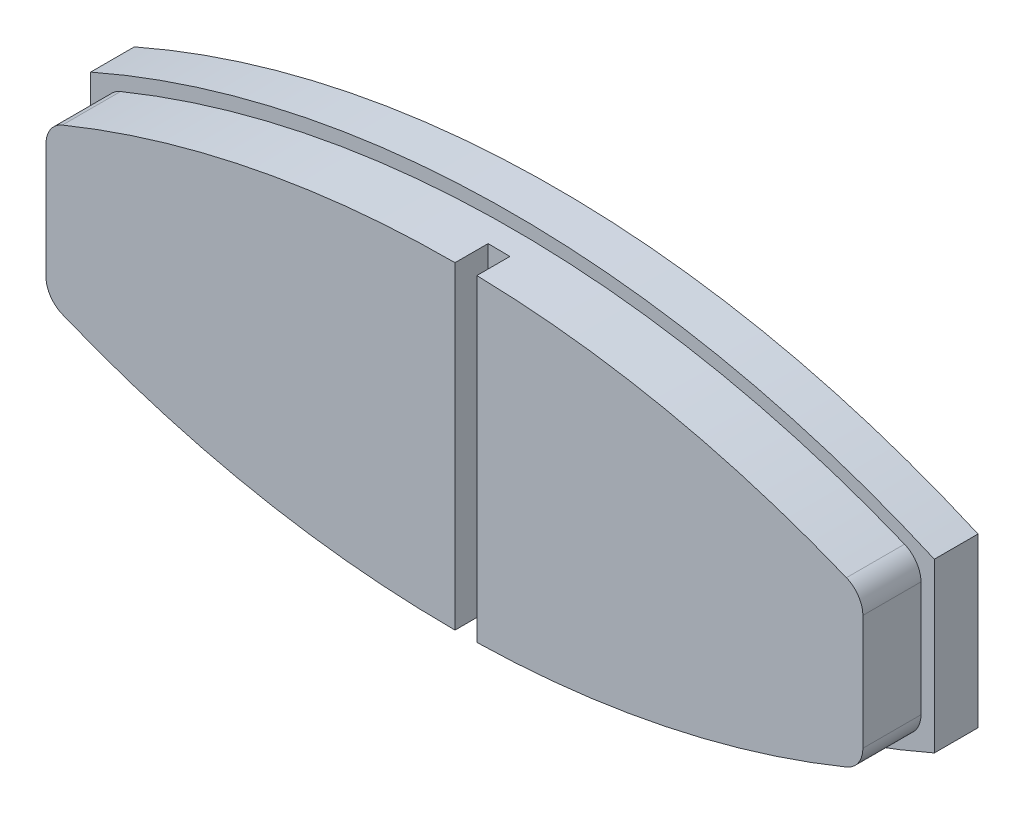
ISO-10303-21;
HEADER;
FILE_DESCRIPTION(('STEP AP214'),'2;1');
FILE_NAME('part.step','',(''),(''),'','','');
FILE_SCHEMA(('AUTOMOTIVE_DESIGN { 1 0 10303 214 1 1 1 1 }'));
ENDSEC;
DATA;
#1=APPLICATION_CONTEXT('core data for automotive mechanical design processes');
#2=APPLICATION_PROTOCOL_DEFINITION('international standard','automotive_design',2000,#1);
#3=PRODUCT_CONTEXT('',#1,'mechanical');
#4=PRODUCT('Part','Part','',(#3));
#5=PRODUCT_RELATED_PRODUCT_CATEGORY('part','',(#4));
#6=PRODUCT_DEFINITION_FORMATION('','',#4);
#7=PRODUCT_DEFINITION_CONTEXT('part definition',#1,'design');
#8=PRODUCT_DEFINITION('design','',#6,#7);
#9=PRODUCT_DEFINITION_SHAPE('','',#8);
#10=(LENGTH_UNIT() NAMED_UNIT(*) SI_UNIT(.MILLI.,.METRE.));
#11=(NAMED_UNIT(*) PLANE_ANGLE_UNIT() SI_UNIT($,.RADIAN.));
#12=(NAMED_UNIT(*) SI_UNIT($,.STERADIAN.) SOLID_ANGLE_UNIT());
#13=UNCERTAINTY_MEASURE_WITH_UNIT(LENGTH_MEASURE(1.E-05),#10,'distance_accuracy_value','');
#14=(GEOMETRIC_REPRESENTATION_CONTEXT(3) GLOBAL_UNCERTAINTY_ASSIGNED_CONTEXT((#13)) GLOBAL_UNIT_ASSIGNED_CONTEXT((#10,
#11,#12)) REPRESENTATION_CONTEXT('',''));
#15=CARTESIAN_POINT('',(0.,0.,0.));
#16=DIRECTION('',(0.,0.,1.));
#17=DIRECTION('',(1.,0.,0.));
#18=AXIS2_PLACEMENT_3D('',#15,#16,#17);
#19=CARTESIAN_POINT('',(0.,-66.2769013020833,7.6962));
#20=DIRECTION('',(0.,0.,1.));
#21=DIRECTION('',(1.,0.,0.));
#22=AXIS2_PLACEMENT_3D('',#19,#20,#21);
#23=PLANE('',#22);
#24=DIRECTION('',(0.,-1.,0.));
#25=VECTOR('',#24,1.);
#26=CARTESIAN_POINT('',(-30.90545,5.68369580839595,7.6962));
#27=LINE('',#26,#25);
#28=CARTESIAN_POINT('',(-30.90545,4.3537105548756,7.6962));
#29=VERTEX_POINT('',#28);
#30=CARTESIAN_POINT('',(-30.90545,-4.35371055487559,7.6962));
#31=VERTEX_POINT('',#30);
#32=EDGE_CURVE('E150',#29,#31,#27,.T.);
#33=ORIENTED_EDGE('',*,*,#32,.T.);
#34=CARTESIAN_POINT('',(-28.90545,-4.35371055487559,7.6962));
#35=DIRECTION('',(0.,0.,1.));
#36=DIRECTION('',(1.,0.,0.));
#37=AXIS2_PLACEMENT_3D('',#34,#35,#36);
#38=CIRCLE('',#37,2.);
#39=CARTESIAN_POINT('',(-29.66296507228,-6.20470242824206,7.6962));
#40=VERTEX_POINT('',#39);
#41=EDGE_CURVE('E219',#31,#40,#38,.T.);
#42=ORIENTED_EDGE('',*,*,#41,.T.);
#43=CARTESIAN_POINT('',(0.,66.2769013020833,7.6962));
#44=DIRECTION('',(0.,0.,1.));
#45=DIRECTION('',(1.,0.,0.));
#46=AXIS2_PLACEMENT_3D('',#43,#44,#45);
#47=CIRCLE('',#46,78.3165013020833);
#48=CARTESIAN_POINT('',(0.044450000000005,-12.0395873857832,7.6962));
#49=VERTEX_POINT('',#48);
#50=EDGE_CURVE('E183',#40,#49,#47,.T.);
#51=ORIENTED_EDGE('',*,*,#50,.T.);
#52=DIRECTION('',(0.,-1.,0.));
#53=VECTOR('',#52,1.);
#54=CARTESIAN_POINT('',(0.0444500000000116,-66.2769013020833,7.6962));
#55=LINE('',#54,#53);
#56=CARTESIAN_POINT('',(0.044450000000002,12.0395873857832,7.6962));
#57=VERTEX_POINT('',#56);
#58=EDGE_CURVE('E160',#57,#49,#55,.T.);
#59=ORIENTED_EDGE('',*,*,#58,.F.);
#60=CARTESIAN_POINT('',(0.,-66.2769013020833,7.6962));
#61=DIRECTION('',(0.,0.,1.));
#62=DIRECTION('',(1.,0.,0.));
#63=AXIS2_PLACEMENT_3D('',#60,#61,#62);
#64=CIRCLE('',#63,78.3165013020833);
#65=CARTESIAN_POINT('',(-29.6629650722799,6.20470242824206,7.6962));
#66=VERTEX_POINT('',#65);
#67=EDGE_CURVE('E151',#57,#66,#64,.T.);
#68=ORIENTED_EDGE('',*,*,#67,.T.);
#69=CARTESIAN_POINT('',(-28.90545,4.3537105548756,7.6962));
#70=DIRECTION('',(0.,0.,1.));
#71=DIRECTION('',(1.,0.,0.));
#72=AXIS2_PLACEMENT_3D('',#69,#70,#71);
#73=CIRCLE('',#72,2.);
#74=EDGE_CURVE('E217',#66,#29,#73,.T.);
#75=ORIENTED_EDGE('',*,*,#74,.T.);
#76=EDGE_LOOP('',(#33,#42,#51,#59,#68,#75));
#77=FACE_BOUND('',#76,.T.);
#78=ADVANCED_FACE('F52',(#77),#23,.T.);
#79=CARTESIAN_POINT('',(0.,-66.2769013020833,7.6962));
#80=DIRECTION('',(0.,0.,-1.));
#81=DIRECTION('',(-1.,0.,0.));
#82=AXIS2_PLACEMENT_3D('',#79,#80,#81);
#83=CYLINDRICAL_SURFACE('',#82,78.3165013020833);
#84=CARTESIAN_POINT('',(0.,-66.2769013020833,3.302));
#85=DIRECTION('',(0.,0.,1.));
#86=DIRECTION('',(1.,0.,0.));
#87=AXIS2_PLACEMENT_3D('',#84,#85,#86);
#88=CIRCLE('',#87,78.3165013020833);
#89=CARTESIAN_POINT('',(29.6629650722799,6.20470242824206,3.302));
#90=VERTEX_POINT('',#89);
#91=CARTESIAN_POINT('',(-29.6629650722799,6.20470242824206,3.302));
#92=VERTEX_POINT('',#91);
#93=EDGE_CURVE('E178',#90,#92,#88,.T.);
#94=ORIENTED_EDGE('',*,*,#93,.T.);
#95=DIRECTION('',(0.,0.,-1.));
#96=VECTOR('',#95,1.);
#97=CARTESIAN_POINT('',(-29.6629650722799,6.20470242824206,7.6962));
#98=LINE('',#97,#96);
#99=EDGE_CURVE('E223',#92,#66,#98,.F.);
#100=ORIENTED_EDGE('',*,*,#99,.T.);
#101=ORIENTED_EDGE('',*,*,#67,.F.);
#102=DIRECTION('',(0.,0.,-1.));
#103=VECTOR('',#102,1.);
#104=CARTESIAN_POINT('',(0.044450000000002,12.0395873857832,7.6962));
#105=LINE('',#104,#103);
#106=CARTESIAN_POINT('',(0.044450000000002,12.0395873857832,5.1962));
#107=VERTEX_POINT('',#106);
#108=EDGE_CURVE('E171',#57,#107,#105,.T.);
#109=ORIENTED_EDGE('',*,*,#108,.T.);
#110=CARTESIAN_POINT('',(0.,-66.2769013020833,5.1962));
#111=DIRECTION('',(0.,0.,1.));
#112=DIRECTION('',(1.,0.,0.));
#113=AXIS2_PLACEMENT_3D('',#110,#111,#112);
#114=CIRCLE('',#113,78.3165013020833);
#115=CARTESIAN_POINT('',(1.69545,12.0212457098142,5.1962));
#116=VERTEX_POINT('',#115);
#117=EDGE_CURVE('E167',#116,#107,#114,.T.);
#118=ORIENTED_EDGE('',*,*,#117,.F.);
#119=DIRECTION('',(0.,0.,-1.));
#120=VECTOR('',#119,1.);
#121=CARTESIAN_POINT('',(1.69545,12.0212457098142,7.6962));
#122=LINE('',#121,#120);
#123=CARTESIAN_POINT('',(1.69545,12.0212457098142,7.6962));
#124=VERTEX_POINT('',#123);
#125=EDGE_CURVE('E156',#116,#124,#122,.F.);
#126=ORIENTED_EDGE('',*,*,#125,.T.);
#127=CARTESIAN_POINT('',(29.6629650722799,6.20470242824206,7.6962));
#128=VERTEX_POINT('',#127);
#129=EDGE_CURVE('E140',#128,#124,#64,.T.);
#130=ORIENTED_EDGE('',*,*,#129,.F.);
#131=DIRECTION('',(0.,0.,-1.));
#132=VECTOR('',#131,1.);
#133=CARTESIAN_POINT('',(29.6629650722799,6.20470242824206,7.6962));
#134=LINE('',#133,#132);
#135=EDGE_CURVE('E221',#128,#90,#134,.T.);
#136=ORIENTED_EDGE('',*,*,#135,.T.);
#137=EDGE_LOOP('',(#94,#100,#101,#109,#118,#126,#130,#136));
#138=FACE_BOUND('',#137,.T.);
#139=ADVANCED_FACE('F165',(#138),#83,.T.);
#140=CARTESIAN_POINT('',(-30.90545,5.68369580839595,7.6962));
#141=DIRECTION('',(1.,0.,0.));
#142=DIRECTION('',(0.,1.,0.));
#143=AXIS2_PLACEMENT_3D('',#140,#141,#142);
#144=PLANE('',#143);
#145=DIRECTION('',(0.,-1.,0.));
#146=VECTOR('',#145,1.);
#147=CARTESIAN_POINT('',(-30.90545,5.68369580839595,3.302));
#148=LINE('',#147,#146);
#149=CARTESIAN_POINT('',(-30.90545,4.3537105548756,3.302));
#150=VERTEX_POINT('',#149);
#151=CARTESIAN_POINT('',(-30.90545,-4.35371055487559,3.302));
#152=VERTEX_POINT('',#151);
#153=EDGE_CURVE('E187',#150,#152,#148,.T.);
#154=ORIENTED_EDGE('',*,*,#153,.T.);
#155=DIRECTION('',(0.,0.,-1.));
#156=VECTOR('',#155,1.);
#157=CARTESIAN_POINT('',(-30.90545,-4.35371055487559,7.6962));
#158=LINE('',#157,#156);
#159=EDGE_CURVE('E215',#152,#31,#158,.F.);
#160=ORIENTED_EDGE('',*,*,#159,.T.);
#161=ORIENTED_EDGE('',*,*,#32,.F.);
#162=DIRECTION('',(0.,0.,-1.));
#163=VECTOR('',#162,1.);
#164=CARTESIAN_POINT('',(-30.90545,4.3537105548756,7.6962));
#165=LINE('',#164,#163);
#166=EDGE_CURVE('E212',#29,#150,#165,.T.);
#167=ORIENTED_EDGE('',*,*,#166,.T.);
#168=EDGE_LOOP('',(#154,#160,#161,#167));
#169=FACE_BOUND('',#168,.T.);
#170=ADVANCED_FACE('F250',(#169),#144,.F.);
#171=CARTESIAN_POINT('',(0.,66.2769013020833,7.6962));
#172=DIRECTION('',(0.,0.,-1.));
#173=DIRECTION('',(-1.,0.,0.));
#174=AXIS2_PLACEMENT_3D('',#171,#172,#173);
#175=CYLINDRICAL_SURFACE('',#174,78.3165013020833);
#176=ORIENTED_EDGE('',*,*,#50,.F.);
#177=DIRECTION('',(0.,0.,-1.));
#178=VECTOR('',#177,1.);
#179=CARTESIAN_POINT('',(-29.66296507228,-6.20470242824206,7.6962));
#180=LINE('',#179,#178);
#181=CARTESIAN_POINT('',(-29.66296507228,-6.20470242824206,3.302));
#182=VERTEX_POINT('',#181);
#183=EDGE_CURVE('E201',#40,#182,#180,.T.);
#184=ORIENTED_EDGE('',*,*,#183,.T.);
#185=CARTESIAN_POINT('',(0.,66.2769013020833,3.302));
#186=DIRECTION('',(0.,0.,1.));
#187=DIRECTION('',(1.,0.,0.));
#188=AXIS2_PLACEMENT_3D('',#185,#186,#187);
#189=CIRCLE('',#188,78.3165013020833);
#190=CARTESIAN_POINT('',(29.6629650722799,-6.20470242824206,3.302));
#191=VERTEX_POINT('',#190);
#192=EDGE_CURVE('E190',#182,#191,#189,.T.);
#193=ORIENTED_EDGE('',*,*,#192,.T.);
#194=DIRECTION('',(0.,0.,-1.));
#195=VECTOR('',#194,1.);
#196=CARTESIAN_POINT('',(29.6629650722799,-6.20470242824206,7.6962));
#197=LINE('',#196,#195);
#198=CARTESIAN_POINT('',(29.6629650722799,-6.20470242824206,7.6962));
#199=VERTEX_POINT('',#198);
#200=EDGE_CURVE('E199',#191,#199,#197,.F.);
#201=ORIENTED_EDGE('',*,*,#200,.T.);
#202=CARTESIAN_POINT('',(1.69545,-12.0212457098142,7.6962));
#203=VERTEX_POINT('',#202);
#204=EDGE_CURVE('E182',#203,#199,#47,.T.);
#205=ORIENTED_EDGE('',*,*,#204,.F.);
#206=DIRECTION('',(0.,0.,-1.));
#207=VECTOR('',#206,1.);
#208=CARTESIAN_POINT('',(1.69545,-12.0212457098142,7.6962));
#209=LINE('',#208,#207);
#210=CARTESIAN_POINT('',(1.69545,-12.0212457098142,5.1962));
#211=VERTEX_POINT('',#210);
#212=EDGE_CURVE('E159',#203,#211,#209,.T.);
#213=ORIENTED_EDGE('',*,*,#212,.T.);
#214=CARTESIAN_POINT('',(0.,66.2769013020833,5.1962));
#215=DIRECTION('',(0.,0.,1.));
#216=DIRECTION('',(1.,0.,0.));
#217=AXIS2_PLACEMENT_3D('',#214,#215,#216);
#218=CIRCLE('',#217,78.3165013020833);
#219=CARTESIAN_POINT('',(0.044450000000005,-12.0395873857832,5.1962));
#220=VERTEX_POINT('',#219);
#221=EDGE_CURVE('E197',#220,#211,#218,.T.);
#222=ORIENTED_EDGE('',*,*,#221,.F.);
#223=DIRECTION('',(0.,0.,-1.));
#224=VECTOR('',#223,1.);
#225=CARTESIAN_POINT('',(0.044450000000005,-12.0395873857832,7.6962));
#226=LINE('',#225,#224);
#227=EDGE_CURVE('E168',#220,#49,#226,.F.);
#228=ORIENTED_EDGE('',*,*,#227,.T.);
#229=EDGE_LOOP('',(#176,#184,#193,#201,#205,#213,#222,#228));
#230=FACE_BOUND('',#229,.T.);
#231=ADVANCED_FACE('F258',(#230),#175,.T.);
#232=CARTESIAN_POINT('',(30.90545,-5.68369580839595,7.6962));
#233=DIRECTION('',(-1.,0.,0.));
#234=DIRECTION('',(0.,0.,1.));
#235=AXIS2_PLACEMENT_3D('',#232,#233,#234);
#236=PLANE('',#235);
#237=DIRECTION('',(0.,1.,0.));
#238=VECTOR('',#237,1.);
#239=CARTESIAN_POINT('',(30.90545,-5.68369580839595,3.302));
#240=LINE('',#239,#238);
#241=CARTESIAN_POINT('',(30.90545,-4.35371055487559,3.302));
#242=VERTEX_POINT('',#241);
#243=CARTESIAN_POINT('',(30.90545,4.35371055487559,3.302));
#244=VERTEX_POINT('',#243);
#245=EDGE_CURVE('E193',#242,#244,#240,.T.);
#246=ORIENTED_EDGE('',*,*,#245,.T.);
#247=DIRECTION('',(0.,0.,-1.));
#248=VECTOR('',#247,1.);
#249=CARTESIAN_POINT('',(30.90545,4.35371055487559,7.6962));
#250=LINE('',#249,#248);
#251=CARTESIAN_POINT('',(30.90545,4.35371055487559,7.6962));
#252=VERTEX_POINT('',#251);
#253=EDGE_CURVE('E67',#244,#252,#250,.F.);
#254=ORIENTED_EDGE('',*,*,#253,.T.);
#255=DIRECTION('',(0.,1.,0.));
#256=VECTOR('',#255,1.);
#257=CARTESIAN_POINT('',(30.90545,-5.68369580839595,7.6962));
#258=LINE('',#257,#256);
#259=CARTESIAN_POINT('',(30.90545,-4.35371055487559,7.6962));
#260=VERTEX_POINT('',#259);
#261=EDGE_CURVE('E161',#260,#252,#258,.T.);
#262=ORIENTED_EDGE('',*,*,#261,.F.);
#263=DIRECTION('',(0.,0.,-1.));
#264=VECTOR('',#263,1.);
#265=CARTESIAN_POINT('',(30.90545,-4.35371055487559,7.6962));
#266=LINE('',#265,#264);
#267=EDGE_CURVE('E225',#260,#242,#266,.T.);
#268=ORIENTED_EDGE('',*,*,#267,.T.);
#269=EDGE_LOOP('',(#246,#254,#262,#268));
#270=FACE_BOUND('',#269,.T.);
#271=ADVANCED_FACE('F230',(#270),#236,.F.);
#272=ORIENTED_EDGE('',*,*,#261,.T.);
#273=CARTESIAN_POINT('',(28.90545,4.35371055487559,7.6962));
#274=DIRECTION('',(0.,0.,1.));
#275=DIRECTION('',(1.,0.,0.));
#276=AXIS2_PLACEMENT_3D('',#273,#274,#275);
#277=CIRCLE('',#276,2.);
#278=EDGE_CURVE('E12',#252,#128,#277,.T.);
#279=ORIENTED_EDGE('',*,*,#278,.T.);
#280=ORIENTED_EDGE('',*,*,#129,.T.);
#281=DIRECTION('',(0.,1.,0.));
#282=VECTOR('',#281,1.);
#283=CARTESIAN_POINT('',(1.69545000000001,-66.2769013020833,7.6962));
#284=LINE('',#283,#282);
#285=EDGE_CURVE('E143',#203,#124,#284,.T.);
#286=ORIENTED_EDGE('',*,*,#285,.F.);
#287=ORIENTED_EDGE('',*,*,#204,.T.);
#288=CARTESIAN_POINT('',(28.90545,-4.35371055487559,7.6962));
#289=DIRECTION('',(0.,0.,1.));
#290=DIRECTION('',(1.,0.,0.));
#291=AXIS2_PLACEMENT_3D('',#288,#289,#290);
#292=CIRCLE('',#291,2.);
#293=EDGE_CURVE('E60',#199,#260,#292,.T.);
#294=ORIENTED_EDGE('',*,*,#293,.T.);
#295=EDGE_LOOP('',(#272,#279,#280,#286,#287,#294));
#296=FACE_BOUND('',#295,.T.);
#297=ADVANCED_FACE('F142',(#296),#23,.T.);
#298=CARTESIAN_POINT('',(0.,-66.2769013020833,3.302));
#299=DIRECTION('',(0.,0.,1.));
#300=DIRECTION('',(1.,0.,0.));
#301=AXIS2_PLACEMENT_3D('',#298,#299,#300);
#302=PLANE('',#301);
#303=ORIENTED_EDGE('',*,*,#192,.F.);
#304=CARTESIAN_POINT('',(-28.90545,-4.35371055487559,3.302));
#305=DIRECTION('',(0.,0.,1.));
#306=DIRECTION('',(1.,0.,0.));
#307=AXIS2_PLACEMENT_3D('',#304,#305,#306);
#308=CIRCLE('',#307,2.);
#309=EDGE_CURVE('E210',#182,#152,#308,.F.);
#310=ORIENTED_EDGE('',*,*,#309,.T.);
#311=ORIENTED_EDGE('',*,*,#153,.F.);
#312=CARTESIAN_POINT('',(-28.90545,4.3537105548756,3.302));
#313=DIRECTION('',(0.,0.,1.));
#314=DIRECTION('',(1.,0.,0.));
#315=AXIS2_PLACEMENT_3D('',#312,#313,#314);
#316=CIRCLE('',#315,2.);
#317=EDGE_CURVE('E208',#150,#92,#316,.F.);
#318=ORIENTED_EDGE('',*,*,#317,.T.);
#319=ORIENTED_EDGE('',*,*,#93,.F.);
#320=CARTESIAN_POINT('',(28.90545,4.35371055487559,3.302));
#321=DIRECTION('',(0.,0.,1.));
#322=DIRECTION('',(1.,0.,0.));
#323=AXIS2_PLACEMENT_3D('',#320,#321,#322);
#324=CIRCLE('',#323,2.);
#325=EDGE_CURVE('E206',#90,#244,#324,.F.);
#326=ORIENTED_EDGE('',*,*,#325,.T.);
#327=ORIENTED_EDGE('',*,*,#245,.F.);
#328=CARTESIAN_POINT('',(28.90545,-4.35371055487559,3.302));
#329=DIRECTION('',(0.,0.,1.));
#330=DIRECTION('',(1.,0.,0.));
#331=AXIS2_PLACEMENT_3D('',#328,#329,#330);
#332=CIRCLE('',#331,2.);
#333=EDGE_CURVE('E204',#242,#191,#332,.F.);
#334=ORIENTED_EDGE('',*,*,#333,.T.);
#335=EDGE_LOOP('',(#303,#310,#311,#318,#319,#326,#327,#334));
#336=FACE_BOUND('',#335,.T.);
#337=ADVANCED_FACE('F234',(#336),#302,.F.);
#338=CARTESIAN_POINT('',(0.,0.,5.1962));
#339=DIRECTION('',(0.,0.,1.));
#340=DIRECTION('',(1.,0.,0.));
#341=AXIS2_PLACEMENT_3D('',#338,#339,#340);
#342=PLANE('',#341);
#343=ORIENTED_EDGE('',*,*,#117,.T.);
#344=DIRECTION('',(0.,-1.,0.));
#345=VECTOR('',#344,1.);
#346=CARTESIAN_POINT('',(0.0444500000000012,18.5167794108381,5.1962));
#347=LINE('',#346,#345);
#348=EDGE_CURVE('E264',#107,#220,#347,.T.);
#349=ORIENTED_EDGE('',*,*,#348,.T.);
#350=ORIENTED_EDGE('',*,*,#221,.T.);
#351=DIRECTION('',(0.,1.,0.));
#352=VECTOR('',#351,1.);
#353=CARTESIAN_POINT('',(1.69545,18.5167794108381,5.1962));
#354=LINE('',#353,#352);
#355=EDGE_CURVE('E173',#211,#116,#354,.T.);
#356=ORIENTED_EDGE('',*,*,#355,.T.);
#357=EDGE_LOOP('',(#343,#349,#350,#356));
#358=FACE_BOUND('',#357,.T.);
#359=ADVANCED_FACE('F266',(#358),#342,.T.);
#360=CARTESIAN_POINT('',(0.0444500000000012,18.5167794108381,5.1962));
#361=DIRECTION('',(-1.,0.,0.));
#362=DIRECTION('',(0.,-1.,0.));
#363=AXIS2_PLACEMENT_3D('',#360,#361,#362);
#364=PLANE('',#363);
#365=ORIENTED_EDGE('',*,*,#58,.T.);
#366=ORIENTED_EDGE('',*,*,#227,.F.);
#367=ORIENTED_EDGE('',*,*,#348,.F.);
#368=ORIENTED_EDGE('',*,*,#108,.F.);
#369=EDGE_LOOP('',(#365,#366,#367,#368));
#370=FACE_BOUND('',#369,.T.);
#371=ADVANCED_FACE('F263',(#370),#364,.F.);
#372=CARTESIAN_POINT('',(1.69545,18.5167794108381,5.1962));
#373=DIRECTION('',(1.,0.,0.));
#374=DIRECTION('',(0.,1.,0.));
#375=AXIS2_PLACEMENT_3D('',#372,#373,#374);
#376=PLANE('',#375);
#377=ORIENTED_EDGE('',*,*,#355,.F.);
#378=ORIENTED_EDGE('',*,*,#212,.F.);
#379=ORIENTED_EDGE('',*,*,#285,.T.);
#380=ORIENTED_EDGE('',*,*,#125,.F.);
#381=EDGE_LOOP('',(#377,#378,#379,#380));
#382=FACE_BOUND('',#381,.T.);
#383=ADVANCED_FACE('F155',(#382),#376,.F.);
#384=CARTESIAN_POINT('',(-28.90545,-4.35371055487559,7.6962));
#385=DIRECTION('',(0.,0.,-1.));
#386=DIRECTION('',(-1.,0.,0.));
#387=AXIS2_PLACEMENT_3D('',#384,#385,#386);
#388=CYLINDRICAL_SURFACE('',#387,2.);
#389=ORIENTED_EDGE('',*,*,#41,.F.);
#390=ORIENTED_EDGE('',*,*,#159,.F.);
#391=ORIENTED_EDGE('',*,*,#309,.F.);
#392=ORIENTED_EDGE('',*,*,#183,.F.);
#393=EDGE_LOOP('',(#389,#390,#391,#392));
#394=FACE_BOUND('',#393,.T.);
#395=ADVANCED_FACE('F254',(#394),#388,.T.);
#396=CARTESIAN_POINT('',(-28.90545,4.3537105548756,7.6962));
#397=DIRECTION('',(0.,0.,-1.));
#398=DIRECTION('',(-1.,0.,0.));
#399=AXIS2_PLACEMENT_3D('',#396,#397,#398);
#400=CYLINDRICAL_SURFACE('',#399,2.);
#401=ORIENTED_EDGE('',*,*,#74,.F.);
#402=ORIENTED_EDGE('',*,*,#99,.F.);
#403=ORIENTED_EDGE('',*,*,#317,.F.);
#404=ORIENTED_EDGE('',*,*,#166,.F.);
#405=EDGE_LOOP('',(#401,#402,#403,#404));
#406=FACE_BOUND('',#405,.T.);
#407=ADVANCED_FACE('F243',(#406),#400,.T.);
#408=CARTESIAN_POINT('',(28.90545,4.35371055487559,7.6962));
#409=DIRECTION('',(0.,0.,-1.));
#410=DIRECTION('',(-1.,0.,0.));
#411=AXIS2_PLACEMENT_3D('',#408,#409,#410);
#412=CYLINDRICAL_SURFACE('',#411,2.);
#413=ORIENTED_EDGE('',*,*,#278,.F.);
#414=ORIENTED_EDGE('',*,*,#253,.F.);
#415=ORIENTED_EDGE('',*,*,#325,.F.);
#416=ORIENTED_EDGE('',*,*,#135,.F.);
#417=EDGE_LOOP('',(#413,#414,#415,#416));
#418=FACE_BOUND('',#417,.T.);
#419=ADVANCED_FACE('F237',(#418),#412,.T.);
#420=CARTESIAN_POINT('',(28.90545,-4.35371055487559,7.6962));
#421=DIRECTION('',(0.,0.,-1.));
#422=DIRECTION('',(-1.,0.,0.));
#423=AXIS2_PLACEMENT_3D('',#420,#421,#422);
#424=CYLINDRICAL_SURFACE('',#423,2.);
#425=ORIENTED_EDGE('',*,*,#293,.F.);
#426=ORIENTED_EDGE('',*,*,#200,.F.);
#427=ORIENTED_EDGE('',*,*,#333,.F.);
#428=ORIENTED_EDGE('',*,*,#267,.F.);
#429=EDGE_LOOP('',(#425,#426,#427,#428));
#430=FACE_BOUND('',#429,.T.);
#431=ADVANCED_FACE('F54',(#430),#424,.T.);
#432=CLOSED_SHELL('',(#78,#139,#170,#231,#271,#297,#337,#359,#371,#383,#395,#407,#419,#431));
#433=MANIFOLD_SOLID_BREP('B2',#432);
#434=CARTESIAN_POINT('',(0.,-66.2769013020833,3.302));
#435=DIRECTION('',(0.,0.,-1.));
#436=DIRECTION('',(-1.,0.,0.));
#437=AXIS2_PLACEMENT_3D('',#434,#435,#436);
#438=CYLINDRICAL_SURFACE('',#437,79.3325013020833);
#439=CARTESIAN_POINT('',(0.,-66.2769013020833,0.));
#440=DIRECTION('',(0.,0.,1.));
#441=DIRECTION('',(1.,0.,0.));
#442=AXIS2_PLACEMENT_3D('',#439,#440,#441);
#443=CIRCLE('',#442,79.3325013020833);
#444=CARTESIAN_POINT('',(31.92145,6.35,0.));
#445=VERTEX_POINT('',#444);
#446=CARTESIAN_POINT('',(-31.92145,6.35,0.));
#447=VERTEX_POINT('',#446);
#448=EDGE_CURVE('E440',#445,#447,#443,.T.);
#449=ORIENTED_EDGE('',*,*,#448,.T.);
#450=DIRECTION('',(0.,0.,-1.));
#451=VECTOR('',#450,1.);
#452=CARTESIAN_POINT('',(-31.92145,6.35,3.302));
#453=LINE('',#452,#451);
#454=CARTESIAN_POINT('',(-31.92145,6.35,3.302));
#455=VERTEX_POINT('',#454);
#456=EDGE_CURVE('E50',#455,#447,#453,.T.);
#457=ORIENTED_EDGE('',*,*,#456,.F.);
#458=CARTESIAN_POINT('',(0.,-66.2769013020833,3.302));
#459=DIRECTION('',(0.,0.,1.));
#460=DIRECTION('',(1.,0.,0.));
#461=AXIS2_PLACEMENT_3D('',#458,#459,#460);
#462=CIRCLE('',#461,79.3325013020833);
#463=CARTESIAN_POINT('',(31.92145,6.35,3.302));
#464=VERTEX_POINT('',#463);
#465=EDGE_CURVE('E428',#464,#455,#462,.T.);
#466=ORIENTED_EDGE('',*,*,#465,.F.);
#467=DIRECTION('',(0.,0.,-1.));
#468=VECTOR('',#467,1.);
#469=CARTESIAN_POINT('',(31.92145,6.35,3.302));
#470=LINE('',#469,#468);
#471=EDGE_CURVE('E436',#464,#445,#470,.T.);
#472=ORIENTED_EDGE('',*,*,#471,.T.);
#473=EDGE_LOOP('',(#449,#457,#466,#472));
#474=FACE_BOUND('',#473,.T.);
#475=ADVANCED_FACE('F377',(#474),#438,.T.);
#476=CARTESIAN_POINT('',(-31.92145,6.35,3.302));
#477=DIRECTION('',(1.,0.,0.));
#478=DIRECTION('',(0.,0.,-1.));
#479=AXIS2_PLACEMENT_3D('',#476,#477,#478);
#480=PLANE('',#479);
#481=DIRECTION('',(0.,-1.,0.));
#482=VECTOR('',#481,1.);
#483=CARTESIAN_POINT('',(-31.92145,6.35,0.));
#484=LINE('',#483,#482);
#485=CARTESIAN_POINT('',(-31.92145,-6.35000000000001,0.));
#486=VERTEX_POINT('',#485);
#487=EDGE_CURVE('E432',#447,#486,#484,.T.);
#488=ORIENTED_EDGE('',*,*,#487,.T.);
#489=DIRECTION('',(0.,0.,-1.));
#490=VECTOR('',#489,1.);
#491=CARTESIAN_POINT('',(-31.92145,-6.35000000000001,3.302));
#492=LINE('',#491,#490);
#493=CARTESIAN_POINT('',(-31.92145,-6.35000000000001,3.302));
#494=VERTEX_POINT('',#493);
#495=EDGE_CURVE('E385',#494,#486,#492,.T.);
#496=ORIENTED_EDGE('',*,*,#495,.F.);
#497=DIRECTION('',(0.,-1.,0.));
#498=VECTOR('',#497,1.);
#499=CARTESIAN_POINT('',(-31.92145,6.35,3.302));
#500=LINE('',#499,#498);
#501=EDGE_CURVE('E423',#455,#494,#500,.T.);
#502=ORIENTED_EDGE('',*,*,#501,.F.);
#503=ORIENTED_EDGE('',*,*,#456,.T.);
#504=EDGE_LOOP('',(#488,#496,#502,#503));
#505=FACE_BOUND('',#504,.T.);
#506=ADVANCED_FACE('F431',(#505),#480,.F.);
#507=CARTESIAN_POINT('',(0.,66.2769013020833,3.302));
#508=DIRECTION('',(0.,0.,-1.));
#509=DIRECTION('',(-1.,0.,0.));
#510=AXIS2_PLACEMENT_3D('',#507,#508,#509);
#511=CYLINDRICAL_SURFACE('',#510,79.3325013020833);
#512=CARTESIAN_POINT('',(0.,66.2769013020833,0.));
#513=DIRECTION('',(0.,0.,1.));
#514=DIRECTION('',(-1.,0.,0.));
#515=AXIS2_PLACEMENT_3D('',#512,#513,#514);
#516=CIRCLE('',#515,79.3325013020833);
#517=CARTESIAN_POINT('',(31.92145,-6.35,0.));
#518=VERTEX_POINT('',#517);
#519=EDGE_CURVE('E410',#486,#518,#516,.T.);
#520=ORIENTED_EDGE('',*,*,#519,.T.);
#521=DIRECTION('',(0.,0.,-1.));
#522=VECTOR('',#521,1.);
#523=CARTESIAN_POINT('',(31.92145,-6.35,3.302));
#524=LINE('',#523,#522);
#525=CARTESIAN_POINT('',(31.92145,-6.35,3.302));
#526=VERTEX_POINT('',#525);
#527=EDGE_CURVE('E433',#526,#518,#524,.T.);
#528=ORIENTED_EDGE('',*,*,#527,.F.);
#529=CARTESIAN_POINT('',(0.,66.2769013020833,3.302));
#530=DIRECTION('',(0.,0.,1.));
#531=DIRECTION('',(-1.,0.,0.));
#532=AXIS2_PLACEMENT_3D('',#529,#530,#531);
#533=CIRCLE('',#532,79.3325013020833);
#534=EDGE_CURVE('E426',#494,#526,#533,.T.);
#535=ORIENTED_EDGE('',*,*,#534,.F.);
#536=ORIENTED_EDGE('',*,*,#495,.T.);
#537=EDGE_LOOP('',(#520,#528,#535,#536));
#538=FACE_BOUND('',#537,.T.);
#539=ADVANCED_FACE('F434',(#538),#511,.T.);
#540=CARTESIAN_POINT('',(31.92145,6.35,3.302));
#541=DIRECTION('',(-1.,0.,0.));
#542=DIRECTION('',(0.,0.,1.));
#543=AXIS2_PLACEMENT_3D('',#540,#541,#542);
#544=PLANE('',#543);
#545=DIRECTION('',(0.,1.,0.));
#546=VECTOR('',#545,1.);
#547=CARTESIAN_POINT('',(31.92145,6.35,0.));
#548=LINE('',#547,#546);
#549=EDGE_CURVE('E416',#518,#445,#548,.T.);
#550=ORIENTED_EDGE('',*,*,#549,.T.);
#551=ORIENTED_EDGE('',*,*,#471,.F.);
#552=DIRECTION('',(0.,1.,0.));
#553=VECTOR('',#552,1.);
#554=CARTESIAN_POINT('',(31.92145,6.35,3.302));
#555=LINE('',#554,#553);
#556=EDGE_CURVE('E393',#526,#464,#555,.T.);
#557=ORIENTED_EDGE('',*,*,#556,.F.);
#558=ORIENTED_EDGE('',*,*,#527,.T.);
#559=EDGE_LOOP('',(#550,#551,#557,#558));
#560=FACE_BOUND('',#559,.T.);
#561=ADVANCED_FACE('F448',(#560),#544,.F.);
#562=CARTESIAN_POINT('',(0.,-66.2769013020833,3.302));
#563=DIRECTION('',(0.,0.,1.));
#564=DIRECTION('',(1.,0.,0.));
#565=AXIS2_PLACEMENT_3D('',#562,#563,#564);
#566=PLANE('',#565);
#567=CARTESIAN_POINT('',(-23.8125,0.,3.302));
#568=DIRECTION('',(0.,0.,1.));
#569=DIRECTION('',(1.,0.,0.));
#570=AXIS2_PLACEMENT_3D('',#567,#568,#569);
#571=CIRCLE('',#570,3.35);
#572=CARTESIAN_POINT('',(-20.4625,0.,3.302));
#573=VERTEX_POINT('',#572);
#574=EDGE_CURVE('E459',#573,#573,#571,.T.);
#575=ORIENTED_EDGE('',*,*,#574,.F.);
#576=EDGE_LOOP('',(#575));
#577=FACE_BOUND('',#576,.T.);
#578=CARTESIAN_POINT('',(23.8125,0.,3.302));
#579=DIRECTION('',(0.,0.,1.));
#580=DIRECTION('',(1.,0.,0.));
#581=AXIS2_PLACEMENT_3D('',#578,#579,#580);
#582=CIRCLE('',#581,3.35);
#583=CARTESIAN_POINT('',(27.1625,0.,3.302));
#584=VERTEX_POINT('',#583);
#585=EDGE_CURVE('E443',#584,#584,#582,.T.);
#586=ORIENTED_EDGE('',*,*,#585,.F.);
#587=EDGE_LOOP('',(#586));
#588=FACE_BOUND('',#587,.T.);
#589=ORIENTED_EDGE('',*,*,#465,.T.);
#590=ORIENTED_EDGE('',*,*,#501,.T.);
#591=ORIENTED_EDGE('',*,*,#534,.T.);
#592=ORIENTED_EDGE('',*,*,#556,.T.);
#593=EDGE_LOOP('',(#589,#590,#591,#592));
#594=FACE_BOUND('',#593,.T.);
#595=ADVANCED_FACE('F424',(#577,#588,#594),#566,.T.);
#596=CARTESIAN_POINT('',(0.,-66.2769013020833,0.));
#597=DIRECTION('',(0.,0.,1.));
#598=DIRECTION('',(1.,0.,0.));
#599=AXIS2_PLACEMENT_3D('',#596,#597,#598);
#600=PLANE('',#599);
#601=CARTESIAN_POINT('',(-23.8125,0.,0.));
#602=DIRECTION('',(0.,0.,-1.));
#603=DIRECTION('',(1.,0.,0.));
#604=AXIS2_PLACEMENT_3D('',#601,#602,#603);
#605=CIRCLE('',#604,3.35);
#606=CARTESIAN_POINT('',(-20.4625,0.,0.));
#607=VERTEX_POINT('',#606);
#608=EDGE_CURVE('E462',#607,#607,#605,.T.);
#609=ORIENTED_EDGE('',*,*,#608,.F.);
#610=EDGE_LOOP('',(#609));
#611=FACE_BOUND('',#610,.T.);
#612=CARTESIAN_POINT('',(23.8125,0.,0.));
#613=DIRECTION('',(0.,0.,-1.));
#614=DIRECTION('',(-1.,0.,0.));
#615=AXIS2_PLACEMENT_3D('',#612,#613,#614);
#616=CIRCLE('',#615,3.35);
#617=CARTESIAN_POINT('',(20.4625,0.,0.));
#618=VERTEX_POINT('',#617);
#619=EDGE_CURVE('E456',#618,#618,#616,.T.);
#620=ORIENTED_EDGE('',*,*,#619,.F.);
#621=EDGE_LOOP('',(#620));
#622=FACE_BOUND('',#621,.T.);
#623=ORIENTED_EDGE('',*,*,#448,.F.);
#624=ORIENTED_EDGE('',*,*,#549,.F.);
#625=ORIENTED_EDGE('',*,*,#519,.F.);
#626=ORIENTED_EDGE('',*,*,#487,.F.);
#627=EDGE_LOOP('',(#623,#624,#625,#626));
#628=FACE_BOUND('',#627,.T.);
#629=ADVANCED_FACE('F451',(#611,#622,#628),#600,.F.);
#630=CARTESIAN_POINT('',(23.8125,0.,6.35));
#631=DIRECTION('',(0.,0.,-1.));
#632=DIRECTION('',(-1.,0.,0.));
#633=AXIS2_PLACEMENT_3D('',#630,#631,#632);
#634=CYLINDRICAL_SURFACE('',#633,3.35);
#635=ORIENTED_EDGE('',*,*,#585,.T.);
#636=EDGE_LOOP('',(#635));
#637=FACE_BOUND('',#636,.T.);
#638=ORIENTED_EDGE('',*,*,#619,.T.);
#639=EDGE_LOOP('',(#638));
#640=FACE_BOUND('',#639,.T.);
#641=ADVANCED_FACE('F470',(#637,#640),#634,.F.);
#642=CARTESIAN_POINT('',(-23.8125,0.,6.35));
#643=DIRECTION('',(0.,0.,-1.));
#644=DIRECTION('',(-1.,0.,0.));
#645=AXIS2_PLACEMENT_3D('',#642,#643,#644);
#646=CYLINDRICAL_SURFACE('',#645,3.35);
#647=ORIENTED_EDGE('',*,*,#574,.T.);
#648=EDGE_LOOP('',(#647));
#649=FACE_BOUND('',#648,.T.);
#650=ORIENTED_EDGE('',*,*,#608,.T.);
#651=EDGE_LOOP('',(#650));
#652=FACE_BOUND('',#651,.T.);
#653=ADVANCED_FACE('F466',(#649,#652),#646,.F.);
#654=CLOSED_SHELL('',(#475,#506,#539,#561,#595,#629,#641,#653));
#655=MANIFOLD_SOLID_BREP('B6',#654);
#656=ADVANCED_BREP_SHAPE_REPRESENTATION('',(#18,#433,#655),#14);
#657=SHAPE_DEFINITION_REPRESENTATION(#9,#656);
ENDSEC;
END-ISO-10303-21;
